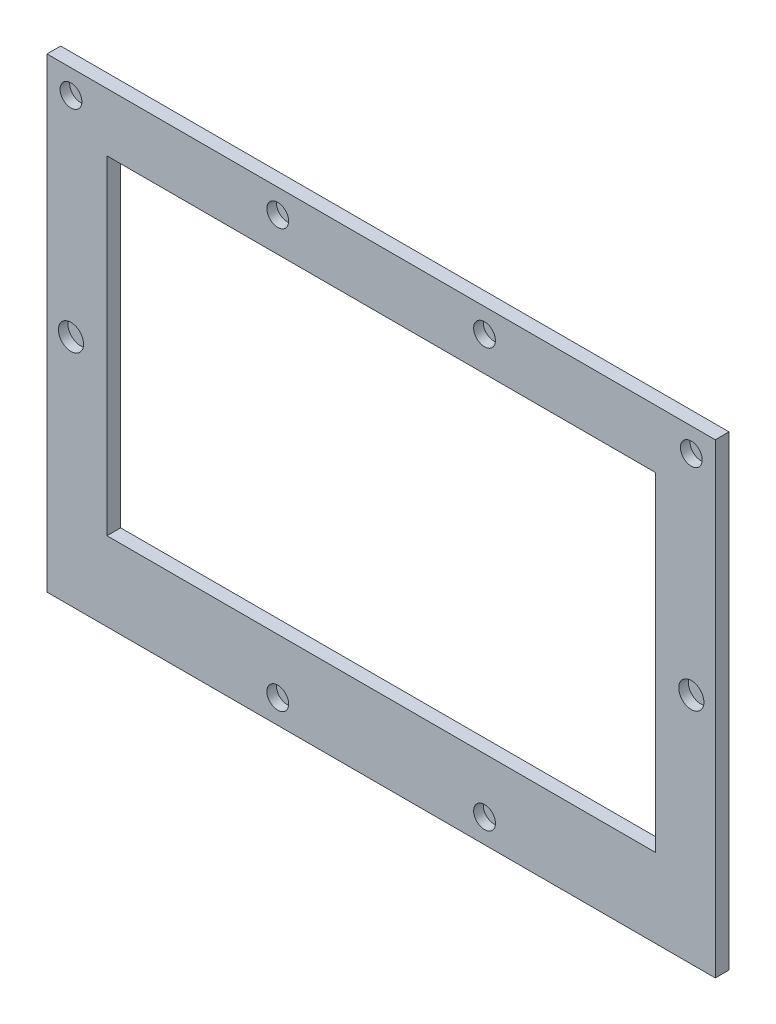
ISO-10303-21;
HEADER;
FILE_DESCRIPTION(('STEP AP214'),'2;1');
FILE_NAME('part.step','',(''),(''),'','','');
FILE_SCHEMA(('AUTOMOTIVE_DESIGN { 1 0 10303 214 1 1 1 1 }'));
ENDSEC;
DATA;
#1=APPLICATION_CONTEXT('core data for automotive mechanical design processes');
#2=APPLICATION_PROTOCOL_DEFINITION('international standard','automotive_design',2000,#1);
#3=PRODUCT_CONTEXT('',#1,'mechanical');
#4=PRODUCT('Part','Part','',(#3));
#5=PRODUCT_RELATED_PRODUCT_CATEGORY('part','',(#4));
#6=PRODUCT_DEFINITION_FORMATION('','',#4);
#7=PRODUCT_DEFINITION_CONTEXT('part definition',#1,'design');
#8=PRODUCT_DEFINITION('design','',#6,#7);
#9=PRODUCT_DEFINITION_SHAPE('','',#8);
#10=(LENGTH_UNIT() NAMED_UNIT(*) SI_UNIT(.MILLI.,.METRE.));
#11=(NAMED_UNIT(*) PLANE_ANGLE_UNIT() SI_UNIT($,.RADIAN.));
#12=(NAMED_UNIT(*) SI_UNIT($,.STERADIAN.) SOLID_ANGLE_UNIT());
#13=UNCERTAINTY_MEASURE_WITH_UNIT(LENGTH_MEASURE(1.E-05),#10,'distance_accuracy_value','');
#14=(GEOMETRIC_REPRESENTATION_CONTEXT(3) GLOBAL_UNCERTAINTY_ASSIGNED_CONTEXT((#13)) GLOBAL_UNIT_ASSIGNED_CONTEXT((#10,
#11,#12)) REPRESENTATION_CONTEXT('',''));
#15=CARTESIAN_POINT('',(0.,0.,0.));
#16=DIRECTION('',(0.,0.,1.));
#17=DIRECTION('',(1.,0.,0.));
#18=AXIS2_PLACEMENT_3D('',#15,#16,#17);
#19=CARTESIAN_POINT('',(0.,68.,-2.));
#20=DIRECTION('',(0.,1.,0.));
#21=DIRECTION('',(0.,0.,1.));
#22=AXIS2_PLACEMENT_3D('',#19,#20,#21);
#23=PLANE('',#22);
#24=DIRECTION('',(0.,0.,1.));
#25=VECTOR('',#24,1.);
#26=CARTESIAN_POINT('',(-97.5,68.,-2.));
#27=LINE('',#26,#25);
#28=CARTESIAN_POINT('',(-97.5,68.,-2.));
#29=VERTEX_POINT('',#28);
#30=CARTESIAN_POINT('',(-97.5,68.,2.));
#31=VERTEX_POINT('',#30);
#32=EDGE_CURVE('E109',#29,#31,#27,.T.);
#33=ORIENTED_EDGE('',*,*,#32,.T.);
#34=DIRECTION('',(-1.,0.,0.));
#35=VECTOR('',#34,1.);
#36=CARTESIAN_POINT('',(0.,68.,2.));
#37=LINE('',#36,#35);
#38=CARTESIAN_POINT('',(97.4999999999999,68.,2.));
#39=VERTEX_POINT('',#38);
#40=EDGE_CURVE('E112',#39,#31,#37,.T.);
#41=ORIENTED_EDGE('',*,*,#40,.F.);
#42=DIRECTION('',(0.,0.,1.));
#43=VECTOR('',#42,1.);
#44=CARTESIAN_POINT('',(97.4999999999999,68.,-2.));
#45=LINE('',#44,#43);
#46=CARTESIAN_POINT('',(97.4999999999999,68.,-2.));
#47=VERTEX_POINT('',#46);
#48=EDGE_CURVE('E11',#47,#39,#45,.T.);
#49=ORIENTED_EDGE('',*,*,#48,.F.);
#50=DIRECTION('',(-1.,0.,0.));
#51=VECTOR('',#50,1.);
#52=CARTESIAN_POINT('',(0.,68.,-2.));
#53=LINE('',#52,#51);
#54=EDGE_CURVE('E115',#47,#29,#53,.T.);
#55=ORIENTED_EDGE('',*,*,#54,.T.);
#56=EDGE_LOOP('',(#33,#41,#49,#55));
#57=FACE_BOUND('',#56,.T.);
#58=ADVANCED_FACE('F45',(#57),#23,.T.);
#59=CARTESIAN_POINT('',(97.4999999999999,0.,-2.));
#60=DIRECTION('',(-1.,0.,0.));
#61=DIRECTION('',(0.,0.,1.));
#62=AXIS2_PLACEMENT_3D('',#59,#60,#61);
#63=PLANE('',#62);
#64=ORIENTED_EDGE('',*,*,#48,.T.);
#65=DIRECTION('',(0.,-1.,0.));
#66=VECTOR('',#65,1.);
#67=CARTESIAN_POINT('',(97.4999999999999,0.,2.));
#68=LINE('',#67,#66);
#69=CARTESIAN_POINT('',(97.4999999999999,-68.,2.));
#70=VERTEX_POINT('',#69);
#71=EDGE_CURVE('E135',#39,#70,#68,.T.);
#72=ORIENTED_EDGE('',*,*,#71,.T.);
#73=DIRECTION('',(0.,0.,1.));
#74=VECTOR('',#73,1.);
#75=CARTESIAN_POINT('',(97.4999999999999,-68.,-2.));
#76=LINE('',#75,#74);
#77=CARTESIAN_POINT('',(97.4999999999999,-68.,-2.));
#78=VERTEX_POINT('',#77);
#79=EDGE_CURVE('E55',#78,#70,#76,.T.);
#80=ORIENTED_EDGE('',*,*,#79,.F.);
#81=DIRECTION('',(0.,-1.,0.));
#82=VECTOR('',#81,1.);
#83=CARTESIAN_POINT('',(97.4999999999999,0.,-2.));
#84=LINE('',#83,#82);
#85=EDGE_CURVE('E186',#47,#78,#84,.T.);
#86=ORIENTED_EDGE('',*,*,#85,.F.);
#87=EDGE_LOOP('',(#64,#72,#80,#86));
#88=FACE_BOUND('',#87,.T.);
#89=ADVANCED_FACE('F228',(#88),#63,.F.);
#90=CARTESIAN_POINT('',(0.,-68.,-2.));
#91=DIRECTION('',(0.,1.,0.));
#92=DIRECTION('',(0.,0.,1.));
#93=AXIS2_PLACEMENT_3D('',#90,#91,#92);
#94=PLANE('',#93);
#95=ORIENTED_EDGE('',*,*,#79,.T.);
#96=DIRECTION('',(-1.,0.,0.));
#97=VECTOR('',#96,1.);
#98=CARTESIAN_POINT('',(0.,-68.,2.));
#99=LINE('',#98,#97);
#100=CARTESIAN_POINT('',(-97.5,-68.,2.));
#101=VERTEX_POINT('',#100);
#102=EDGE_CURVE('E130',#70,#101,#99,.T.);
#103=ORIENTED_EDGE('',*,*,#102,.T.);
#104=DIRECTION('',(0.,0.,1.));
#105=VECTOR('',#104,1.);
#106=CARTESIAN_POINT('',(-97.5,-68.,-2.));
#107=LINE('',#106,#105);
#108=CARTESIAN_POINT('',(-97.5,-68.,-2.));
#109=VERTEX_POINT('',#108);
#110=EDGE_CURVE('E120',#109,#101,#107,.T.);
#111=ORIENTED_EDGE('',*,*,#110,.F.);
#112=DIRECTION('',(-1.,0.,0.));
#113=VECTOR('',#112,1.);
#114=CARTESIAN_POINT('',(0.,-68.,-2.));
#115=LINE('',#114,#113);
#116=EDGE_CURVE('E69',#78,#109,#115,.T.);
#117=ORIENTED_EDGE('',*,*,#116,.F.);
#118=EDGE_LOOP('',(#95,#103,#111,#117));
#119=FACE_BOUND('',#118,.T.);
#120=ADVANCED_FACE('F233',(#119),#94,.F.);
#121=CARTESIAN_POINT('',(0.,-45.,-2.));
#122=DIRECTION('',(0.,1.,0.));
#123=DIRECTION('',(-1.,0.,0.));
#124=AXIS2_PLACEMENT_3D('',#121,#122,#123);
#125=PLANE('',#124);
#126=DIRECTION('',(0.,0.,1.));
#127=VECTOR('',#126,1.);
#128=CARTESIAN_POINT('',(-80.,-45.,-2.));
#129=LINE('',#128,#127);
#130=CARTESIAN_POINT('',(-80.,-45.,-2.));
#131=VERTEX_POINT('',#130);
#132=CARTESIAN_POINT('',(-80.,-45.,2.));
#133=VERTEX_POINT('',#132);
#134=EDGE_CURVE('E49',#131,#133,#129,.T.);
#135=ORIENTED_EDGE('',*,*,#134,.T.);
#136=DIRECTION('',(-1.,0.,0.));
#137=VECTOR('',#136,1.);
#138=CARTESIAN_POINT('',(0.,-45.,2.));
#139=LINE('',#138,#137);
#140=CARTESIAN_POINT('',(80.,-45.,2.));
#141=VERTEX_POINT('',#140);
#142=EDGE_CURVE('E149',#141,#133,#139,.T.);
#143=ORIENTED_EDGE('',*,*,#142,.F.);
#144=DIRECTION('',(0.,0.,1.));
#145=VECTOR('',#144,1.);
#146=CARTESIAN_POINT('',(80.,-45.,-2.));
#147=LINE('',#146,#145);
#148=CARTESIAN_POINT('',(80.,-45.,-2.));
#149=VERTEX_POINT('',#148);
#150=EDGE_CURVE('E121',#149,#141,#147,.T.);
#151=ORIENTED_EDGE('',*,*,#150,.F.);
#152=DIRECTION('',(-1.,0.,0.));
#153=VECTOR('',#152,1.);
#154=CARTESIAN_POINT('',(0.,-45.,-2.));
#155=LINE('',#154,#153);
#156=EDGE_CURVE('E165',#149,#131,#155,.T.);
#157=ORIENTED_EDGE('',*,*,#156,.T.);
#158=EDGE_LOOP('',(#135,#143,#151,#157));
#159=FACE_BOUND('',#158,.T.);
#160=ADVANCED_FACE('F47',(#159),#125,.T.);
#161=CARTESIAN_POINT('',(80.,0.,-2.));
#162=DIRECTION('',(1.,0.,0.));
#163=DIRECTION('',(0.,0.,-1.));
#164=AXIS2_PLACEMENT_3D('',#161,#162,#163);
#165=PLANE('',#164);
#166=ORIENTED_EDGE('',*,*,#150,.T.);
#167=DIRECTION('',(0.,1.,0.));
#168=VECTOR('',#167,1.);
#169=CARTESIAN_POINT('',(80.,0.,2.));
#170=LINE('',#169,#168);
#171=CARTESIAN_POINT('',(80.,51.,2.));
#172=VERTEX_POINT('',#171);
#173=EDGE_CURVE('E161',#141,#172,#170,.T.);
#174=ORIENTED_EDGE('',*,*,#173,.T.);
#175=DIRECTION('',(0.,0.,1.));
#176=VECTOR('',#175,1.);
#177=CARTESIAN_POINT('',(80.,51.,-2.));
#178=LINE('',#177,#176);
#179=CARTESIAN_POINT('',(80.,51.,-2.));
#180=VERTEX_POINT('',#179);
#181=EDGE_CURVE('E195',#180,#172,#178,.T.);
#182=ORIENTED_EDGE('',*,*,#181,.F.);
#183=DIRECTION('',(0.,1.,0.));
#184=VECTOR('',#183,1.);
#185=CARTESIAN_POINT('',(80.,0.,-2.));
#186=LINE('',#185,#184);
#187=EDGE_CURVE('E176',#149,#180,#186,.T.);
#188=ORIENTED_EDGE('',*,*,#187,.F.);
#189=EDGE_LOOP('',(#166,#174,#182,#188));
#190=FACE_BOUND('',#189,.T.);
#191=ADVANCED_FACE('F212',(#190),#165,.F.);
#192=CARTESIAN_POINT('',(0.,51.,-2.));
#193=DIRECTION('',(0.,1.,0.));
#194=DIRECTION('',(-1.,0.,0.));
#195=AXIS2_PLACEMENT_3D('',#192,#193,#194);
#196=PLANE('',#195);
#197=ORIENTED_EDGE('',*,*,#181,.T.);
#198=DIRECTION('',(-1.,0.,0.));
#199=VECTOR('',#198,1.);
#200=CARTESIAN_POINT('',(0.,51.,2.));
#201=LINE('',#200,#199);
#202=CARTESIAN_POINT('',(-80.,51.,2.));
#203=VERTEX_POINT('',#202);
#204=EDGE_CURVE('E157',#172,#203,#201,.T.);
#205=ORIENTED_EDGE('',*,*,#204,.T.);
#206=DIRECTION('',(0.,0.,1.));
#207=VECTOR('',#206,1.);
#208=CARTESIAN_POINT('',(-80.,51.,-2.));
#209=LINE('',#208,#207);
#210=CARTESIAN_POINT('',(-80.,51.,-2.));
#211=VERTEX_POINT('',#210);
#212=EDGE_CURVE('E197',#211,#203,#209,.T.);
#213=ORIENTED_EDGE('',*,*,#212,.F.);
#214=DIRECTION('',(-1.,0.,0.));
#215=VECTOR('',#214,1.);
#216=CARTESIAN_POINT('',(0.,51.,-2.));
#217=LINE('',#216,#215);
#218=EDGE_CURVE('E173',#180,#211,#217,.T.);
#219=ORIENTED_EDGE('',*,*,#218,.F.);
#220=EDGE_LOOP('',(#197,#205,#213,#219));
#221=FACE_BOUND('',#220,.T.);
#222=ADVANCED_FACE('F219',(#221),#196,.F.);
#223=CARTESIAN_POINT('',(-80.,0.,-2.));
#224=DIRECTION('',(1.,0.,0.));
#225=DIRECTION('',(0.,0.,-1.));
#226=AXIS2_PLACEMENT_3D('',#223,#224,#225);
#227=PLANE('',#226);
#228=ORIENTED_EDGE('',*,*,#212,.T.);
#229=DIRECTION('',(0.,1.,0.));
#230=VECTOR('',#229,1.);
#231=CARTESIAN_POINT('',(-80.,0.,2.));
#232=LINE('',#231,#230);
#233=EDGE_CURVE('E153',#133,#203,#232,.T.);
#234=ORIENTED_EDGE('',*,*,#233,.F.);
#235=ORIENTED_EDGE('',*,*,#134,.F.);
#236=DIRECTION('',(0.,1.,0.));
#237=VECTOR('',#236,1.);
#238=CARTESIAN_POINT('',(-80.,0.,-2.));
#239=LINE('',#238,#237);
#240=EDGE_CURVE('E169',#131,#211,#239,.T.);
#241=ORIENTED_EDGE('',*,*,#240,.T.);
#242=EDGE_LOOP('',(#228,#234,#235,#241));
#243=FACE_BOUND('',#242,.T.);
#244=ADVANCED_FACE('F208',(#243),#227,.T.);
#245=CARTESIAN_POINT('',(-97.5,0.,-2.));
#246=DIRECTION('',(-1.,0.,0.));
#247=DIRECTION('',(0.,0.,1.));
#248=AXIS2_PLACEMENT_3D('',#245,#246,#247);
#249=PLANE('',#248);
#250=ORIENTED_EDGE('',*,*,#110,.T.);
#251=DIRECTION('',(0.,-1.,0.));
#252=VECTOR('',#251,1.);
#253=CARTESIAN_POINT('',(-97.5,0.,2.));
#254=LINE('',#253,#252);
#255=EDGE_CURVE('E124',#31,#101,#254,.T.);
#256=ORIENTED_EDGE('',*,*,#255,.F.);
#257=ORIENTED_EDGE('',*,*,#32,.F.);
#258=DIRECTION('',(0.,-1.,0.));
#259=VECTOR('',#258,1.);
#260=CARTESIAN_POINT('',(-97.5,0.,-2.));
#261=LINE('',#260,#259);
#262=EDGE_CURVE('E181',#29,#109,#261,.T.);
#263=ORIENTED_EDGE('',*,*,#262,.T.);
#264=EDGE_LOOP('',(#250,#256,#257,#263));
#265=FACE_BOUND('',#264,.T.);
#266=ADVANCED_FACE('F125',(#265),#249,.T.);
#267=CARTESIAN_POINT('',(0.,0.,-2.));
#268=DIRECTION('',(0.,0.,1.));
#269=DIRECTION('',(1.,0.,0.));
#270=AXIS2_PLACEMENT_3D('',#267,#268,#269);
#271=PLANE('',#270);
#272=ORIENTED_EDGE('',*,*,#156,.F.);
#273=ORIENTED_EDGE('',*,*,#187,.T.);
#274=ORIENTED_EDGE('',*,*,#218,.T.);
#275=ORIENTED_EDGE('',*,*,#240,.F.);
#276=EDGE_LOOP('',(#272,#273,#274,#275));
#277=FACE_BOUND('',#276,.T.);
#278=ORIENTED_EDGE('',*,*,#54,.F.);
#279=ORIENTED_EDGE('',*,*,#85,.T.);
#280=ORIENTED_EDGE('',*,*,#116,.T.);
#281=ORIENTED_EDGE('',*,*,#262,.F.);
#282=EDGE_LOOP('',(#278,#279,#280,#281));
#283=FACE_BOUND('',#282,.T.);
#284=ADVANCED_FACE('F216',(#277,#283),#271,.F.);
#285=CARTESIAN_POINT('',(0.,0.,2.));
#286=DIRECTION('',(0.,0.,1.));
#287=DIRECTION('',(1.,0.,0.));
#288=AXIS2_PLACEMENT_3D('',#285,#286,#287);
#289=PLANE('',#288);
#290=CARTESIAN_POINT('',(-90.5,0.,2.));
#291=DIRECTION('',(0.,0.,1.));
#292=DIRECTION('',(1.,0.,0.));
#293=AXIS2_PLACEMENT_3D('',#290,#291,#292);
#294=CIRCLE('',#293,3.67372256576082);
#295=CARTESIAN_POINT('',(-86.8262774342392,0.,2.));
#296=VERTEX_POINT('',#295);
#297=EDGE_CURVE('E341',#296,#296,#294,.T.);
#298=ORIENTED_EDGE('',*,*,#297,.F.);
#299=EDGE_LOOP('',(#298));
#300=FACE_BOUND('',#299,.T.);
#301=CARTESIAN_POINT('',(90.5,61.,2.));
#302=DIRECTION('',(0.,0.,1.));
#303=DIRECTION('',(1.,0.,0.));
#304=AXIS2_PLACEMENT_3D('',#301,#302,#303);
#305=CIRCLE('',#304,3.175);
#306=CARTESIAN_POINT('',(93.675,61.,2.));
#307=VERTEX_POINT('',#306);
#308=EDGE_CURVE('E349',#307,#307,#305,.T.);
#309=ORIENTED_EDGE('',*,*,#308,.F.);
#310=EDGE_LOOP('',(#309));
#311=FACE_BOUND('',#310,.T.);
#312=CARTESIAN_POINT('',(-30.1666666666667,-61.,2.));
#313=DIRECTION('',(0.,0.,1.));
#314=DIRECTION('',(1.,0.,0.));
#315=AXIS2_PLACEMENT_3D('',#312,#313,#314);
#316=CIRCLE('',#315,3.175);
#317=CARTESIAN_POINT('',(-26.9916666666667,-61.,2.));
#318=VERTEX_POINT('',#317);
#319=EDGE_CURVE('E357',#318,#318,#316,.T.);
#320=ORIENTED_EDGE('',*,*,#319,.F.);
#321=EDGE_LOOP('',(#320));
#322=FACE_BOUND('',#321,.T.);
#323=CARTESIAN_POINT('',(30.1666666666666,-61.,2.));
#324=DIRECTION('',(0.,0.,1.));
#325=DIRECTION('',(1.,0.,0.));
#326=AXIS2_PLACEMENT_3D('',#323,#324,#325);
#327=CIRCLE('',#326,3.175);
#328=CARTESIAN_POINT('',(33.3416666666666,-61.,2.));
#329=VERTEX_POINT('',#328);
#330=EDGE_CURVE('E365',#329,#329,#327,.T.);
#331=ORIENTED_EDGE('',*,*,#330,.F.);
#332=EDGE_LOOP('',(#331));
#333=FACE_BOUND('',#332,.T.);
#334=CARTESIAN_POINT('',(30.1666666666666,61.,2.));
#335=DIRECTION('',(0.,0.,1.));
#336=DIRECTION('',(1.,0.,0.));
#337=AXIS2_PLACEMENT_3D('',#334,#335,#336);
#338=CIRCLE('',#337,3.175);
#339=CARTESIAN_POINT('',(33.3416666666666,61.,2.));
#340=VERTEX_POINT('',#339);
#341=EDGE_CURVE('E317',#340,#340,#338,.T.);
#342=ORIENTED_EDGE('',*,*,#341,.F.);
#343=EDGE_LOOP('',(#342));
#344=FACE_BOUND('',#343,.T.);
#345=CARTESIAN_POINT('',(-30.1666666666667,61.,2.));
#346=DIRECTION('',(0.,0.,1.));
#347=DIRECTION('',(1.,0.,0.));
#348=AXIS2_PLACEMENT_3D('',#345,#346,#347);
#349=CIRCLE('',#348,3.175);
#350=CARTESIAN_POINT('',(-26.9916666666667,61.,2.));
#351=VERTEX_POINT('',#350);
#352=EDGE_CURVE('E325',#351,#351,#349,.T.);
#353=ORIENTED_EDGE('',*,*,#352,.F.);
#354=EDGE_LOOP('',(#353));
#355=FACE_BOUND('',#354,.T.);
#356=CARTESIAN_POINT('',(90.5,0.,2.));
#357=DIRECTION('',(0.,0.,1.));
#358=DIRECTION('',(1.,0.,0.));
#359=AXIS2_PLACEMENT_3D('',#356,#357,#358);
#360=CIRCLE('',#359,3.67372256576082);
#361=CARTESIAN_POINT('',(94.1737225657609,0.,2.));
#362=VERTEX_POINT('',#361);
#363=EDGE_CURVE('E329',#362,#362,#360,.T.);
#364=ORIENTED_EDGE('',*,*,#363,.F.);
#365=EDGE_LOOP('',(#364));
#366=FACE_BOUND('',#365,.T.);
#367=CARTESIAN_POINT('',(-90.5,61.,2.));
#368=DIRECTION('',(0.,0.,1.));
#369=DIRECTION('',(1.,0.,0.));
#370=AXIS2_PLACEMENT_3D('',#367,#368,#369);
#371=CIRCLE('',#370,3.175);
#372=CARTESIAN_POINT('',(-87.325,61.,2.));
#373=VERTEX_POINT('',#372);
#374=EDGE_CURVE('E141',#373,#373,#371,.T.);
#375=ORIENTED_EDGE('',*,*,#374,.F.);
#376=EDGE_LOOP('',(#375));
#377=FACE_BOUND('',#376,.T.);
#378=ORIENTED_EDGE('',*,*,#40,.T.);
#379=ORIENTED_EDGE('',*,*,#255,.T.);
#380=ORIENTED_EDGE('',*,*,#102,.F.);
#381=ORIENTED_EDGE('',*,*,#71,.F.);
#382=EDGE_LOOP('',(#378,#379,#380,#381));
#383=FACE_BOUND('',#382,.T.);
#384=ORIENTED_EDGE('',*,*,#142,.T.);
#385=ORIENTED_EDGE('',*,*,#233,.T.);
#386=ORIENTED_EDGE('',*,*,#204,.F.);
#387=ORIENTED_EDGE('',*,*,#173,.F.);
#388=EDGE_LOOP('',(#384,#385,#386,#387));
#389=FACE_BOUND('',#388,.T.);
#390=ADVANCED_FACE('F132',(#300,#311,#322,#333,#344,#355,#366,#377,#383,#389),#289,.T.);
#391=CARTESIAN_POINT('',(-90.5,61.,-0.794));
#392=DIRECTION('',(0.,0.,1.));
#393=DIRECTION('',(1.,0.,0.));
#394=AXIS2_PLACEMENT_3D('',#391,#392,#393);
#395=CYLINDRICAL_SURFACE('',#394,3.175);
#396=CARTESIAN_POINT('',(-90.5,61.,-0.794));
#397=DIRECTION('',(0.,0.,1.));
#398=DIRECTION('',(1.,0.,0.));
#399=AXIS2_PLACEMENT_3D('',#396,#397,#398);
#400=CIRCLE('',#399,3.175);
#401=CARTESIAN_POINT('',(-87.325,61.,-0.794));
#402=VERTEX_POINT('',#401);
#403=EDGE_CURVE('E137',#402,#402,#400,.T.);
#404=ORIENTED_EDGE('',*,*,#403,.F.);
#405=EDGE_LOOP('',(#404));
#406=FACE_BOUND('',#405,.T.);
#407=ORIENTED_EDGE('',*,*,#374,.T.);
#408=EDGE_LOOP('',(#407));
#409=FACE_BOUND('',#408,.T.);
#410=ADVANCED_FACE('F245',(#406,#409),#395,.F.);
#411=CARTESIAN_POINT('',(-90.5,61.,-0.794));
#412=DIRECTION('',(0.,0.,1.));
#413=DIRECTION('',(1.,0.,0.));
#414=AXIS2_PLACEMENT_3D('',#411,#412,#413);
#415=PLANE('',#414);
#416=ORIENTED_EDGE('',*,*,#403,.T.);
#417=EDGE_LOOP('',(#416));
#418=FACE_BOUND('',#417,.T.);
#419=ADVANCED_FACE('F249',(#418),#415,.T.);
#420=CARTESIAN_POINT('',(90.5,0.,-0.794));
#421=DIRECTION('',(0.,0.,1.));
#422=DIRECTION('',(1.,0.,0.));
#423=AXIS2_PLACEMENT_3D('',#420,#421,#422);
#424=CYLINDRICAL_SURFACE('',#423,3.67372256576082);
#425=CARTESIAN_POINT('',(90.5,0.,-0.794));
#426=DIRECTION('',(0.,0.,1.));
#427=DIRECTION('',(1.,0.,0.));
#428=AXIS2_PLACEMENT_3D('',#425,#426,#427);
#429=CIRCLE('',#428,3.67372256576082);
#430=CARTESIAN_POINT('',(94.1737225657609,0.,-0.794));
#431=VERTEX_POINT('',#430);
#432=EDGE_CURVE('E334',#431,#431,#429,.T.);
#433=ORIENTED_EDGE('',*,*,#432,.F.);
#434=EDGE_LOOP('',(#433));
#435=FACE_BOUND('',#434,.T.);
#436=ORIENTED_EDGE('',*,*,#363,.T.);
#437=EDGE_LOOP('',(#436));
#438=FACE_BOUND('',#437,.T.);
#439=ADVANCED_FACE('F253',(#435,#438),#424,.F.);
#440=CARTESIAN_POINT('',(90.5,0.,-0.794));
#441=DIRECTION('',(0.,0.,1.));
#442=DIRECTION('',(1.,0.,0.));
#443=AXIS2_PLACEMENT_3D('',#440,#441,#442);
#444=PLANE('',#443);
#445=ORIENTED_EDGE('',*,*,#432,.T.);
#446=EDGE_LOOP('',(#445));
#447=FACE_BOUND('',#446,.T.);
#448=ADVANCED_FACE('F296',(#447),#444,.T.);
#449=CARTESIAN_POINT('',(-30.1666666666667,61.,-0.794));
#450=DIRECTION('',(0.,0.,1.));
#451=DIRECTION('',(1.,0.,0.));
#452=AXIS2_PLACEMENT_3D('',#449,#450,#451);
#453=CYLINDRICAL_SURFACE('',#452,3.175);
#454=CARTESIAN_POINT('',(-30.1666666666667,61.,-0.794));
#455=DIRECTION('',(0.,0.,1.));
#456=DIRECTION('',(1.,0.,0.));
#457=AXIS2_PLACEMENT_3D('',#454,#455,#456);
#458=CIRCLE('',#457,3.175);
#459=CARTESIAN_POINT('',(-26.9916666666667,61.,-0.794));
#460=VERTEX_POINT('',#459);
#461=EDGE_CURVE('E320',#460,#460,#458,.T.);
#462=ORIENTED_EDGE('',*,*,#461,.F.);
#463=EDGE_LOOP('',(#462));
#464=FACE_BOUND('',#463,.T.);
#465=ORIENTED_EDGE('',*,*,#352,.T.);
#466=EDGE_LOOP('',(#465));
#467=FACE_BOUND('',#466,.T.);
#468=ADVANCED_FACE('F292',(#464,#467),#453,.F.);
#469=CARTESIAN_POINT('',(-30.1666666666667,61.,-0.794));
#470=DIRECTION('',(0.,0.,1.));
#471=DIRECTION('',(1.,0.,0.));
#472=AXIS2_PLACEMENT_3D('',#469,#470,#471);
#473=PLANE('',#472);
#474=ORIENTED_EDGE('',*,*,#461,.T.);
#475=EDGE_LOOP('',(#474));
#476=FACE_BOUND('',#475,.T.);
#477=ADVANCED_FACE('F288',(#476),#473,.T.);
#478=CARTESIAN_POINT('',(30.1666666666666,61.,-0.794));
#479=DIRECTION('',(0.,0.,1.));
#480=DIRECTION('',(1.,0.,0.));
#481=AXIS2_PLACEMENT_3D('',#478,#479,#480);
#482=CYLINDRICAL_SURFACE('',#481,3.175);
#483=CARTESIAN_POINT('',(30.1666666666666,61.,-0.794));
#484=DIRECTION('',(0.,0.,1.));
#485=DIRECTION('',(1.,0.,0.));
#486=AXIS2_PLACEMENT_3D('',#483,#484,#485);
#487=CIRCLE('',#486,3.175);
#488=CARTESIAN_POINT('',(33.3416666666666,61.,-0.794));
#489=VERTEX_POINT('',#488);
#490=EDGE_CURVE('E314',#489,#489,#487,.T.);
#491=ORIENTED_EDGE('',*,*,#490,.F.);
#492=EDGE_LOOP('',(#491));
#493=FACE_BOUND('',#492,.T.);
#494=ORIENTED_EDGE('',*,*,#341,.T.);
#495=EDGE_LOOP('',(#494));
#496=FACE_BOUND('',#495,.T.);
#497=ADVANCED_FACE('F291',(#493,#496),#482,.F.);
#498=CARTESIAN_POINT('',(30.1666666666666,61.,-0.794));
#499=DIRECTION('',(0.,0.,1.));
#500=DIRECTION('',(1.,0.,0.));
#501=AXIS2_PLACEMENT_3D('',#498,#499,#500);
#502=PLANE('',#501);
#503=ORIENTED_EDGE('',*,*,#490,.T.);
#504=EDGE_LOOP('',(#503));
#505=FACE_BOUND('',#504,.T.);
#506=ADVANCED_FACE('F263',(#505),#502,.T.);
#507=CARTESIAN_POINT('',(30.1666666666666,-61.,-0.794));
#508=DIRECTION('',(0.,0.,1.));
#509=DIRECTION('',(1.,0.,0.));
#510=AXIS2_PLACEMENT_3D('',#507,#508,#509);
#511=CYLINDRICAL_SURFACE('',#510,3.175);
#512=CARTESIAN_POINT('',(30.1666666666666,-61.,-0.794));
#513=DIRECTION('',(0.,0.,1.));
#514=DIRECTION('',(1.,0.,0.));
#515=AXIS2_PLACEMENT_3D('',#512,#513,#514);
#516=CIRCLE('',#515,3.175);
#517=CARTESIAN_POINT('',(33.3416666666666,-61.,-0.794));
#518=VERTEX_POINT('',#517);
#519=EDGE_CURVE('E333',#518,#518,#516,.T.);
#520=ORIENTED_EDGE('',*,*,#519,.F.);
#521=EDGE_LOOP('',(#520));
#522=FACE_BOUND('',#521,.T.);
#523=ORIENTED_EDGE('',*,*,#330,.T.);
#524=EDGE_LOOP('',(#523));
#525=FACE_BOUND('',#524,.T.);
#526=ADVANCED_FACE('F259',(#522,#525),#511,.F.);
#527=CARTESIAN_POINT('',(30.1666666666666,-61.,-0.794));
#528=DIRECTION('',(0.,0.,1.));
#529=DIRECTION('',(1.,0.,0.));
#530=AXIS2_PLACEMENT_3D('',#527,#528,#529);
#531=PLANE('',#530);
#532=ORIENTED_EDGE('',*,*,#519,.T.);
#533=EDGE_LOOP('',(#532));
#534=FACE_BOUND('',#533,.T.);
#535=ADVANCED_FACE('F255',(#534),#531,.T.);
#536=CARTESIAN_POINT('',(-30.1666666666667,-61.,-0.794));
#537=DIRECTION('',(0.,0.,1.));
#538=DIRECTION('',(1.,0.,0.));
#539=AXIS2_PLACEMENT_3D('',#536,#537,#538);
#540=CYLINDRICAL_SURFACE('',#539,3.175);
#541=CARTESIAN_POINT('',(-30.1666666666667,-61.,-0.794));
#542=DIRECTION('',(0.,0.,1.));
#543=DIRECTION('',(1.,0.,0.));
#544=AXIS2_PLACEMENT_3D('',#541,#542,#543);
#545=CIRCLE('',#544,3.175);
#546=CARTESIAN_POINT('',(-26.9916666666667,-61.,-0.794));
#547=VERTEX_POINT('',#546);
#548=EDGE_CURVE('E361',#547,#547,#545,.T.);
#549=ORIENTED_EDGE('',*,*,#548,.F.);
#550=EDGE_LOOP('',(#549));
#551=FACE_BOUND('',#550,.T.);
#552=ORIENTED_EDGE('',*,*,#319,.T.);
#553=EDGE_LOOP('',(#552));
#554=FACE_BOUND('',#553,.T.);
#555=ADVANCED_FACE('F258',(#551,#554),#540,.F.);
#556=CARTESIAN_POINT('',(-30.1666666666667,-61.,-0.794));
#557=DIRECTION('',(0.,0.,1.));
#558=DIRECTION('',(1.,0.,0.));
#559=AXIS2_PLACEMENT_3D('',#556,#557,#558);
#560=PLANE('',#559);
#561=ORIENTED_EDGE('',*,*,#548,.T.);
#562=EDGE_LOOP('',(#561));
#563=FACE_BOUND('',#562,.T.);
#564=ADVANCED_FACE('F265',(#563),#560,.T.);
#565=CARTESIAN_POINT('',(90.5,61.,-0.794));
#566=DIRECTION('',(0.,0.,1.));
#567=DIRECTION('',(1.,0.,0.));
#568=AXIS2_PLACEMENT_3D('',#565,#566,#567);
#569=CYLINDRICAL_SURFACE('',#568,3.175);
#570=CARTESIAN_POINT('',(90.5,61.,-0.794));
#571=DIRECTION('',(0.,0.,1.));
#572=DIRECTION('',(1.,0.,0.));
#573=AXIS2_PLACEMENT_3D('',#570,#571,#572);
#574=CIRCLE('',#573,3.175);
#575=CARTESIAN_POINT('',(93.675,61.,-0.794));
#576=VERTEX_POINT('',#575);
#577=EDGE_CURVE('E353',#576,#576,#574,.T.);
#578=ORIENTED_EDGE('',*,*,#577,.F.);
#579=EDGE_LOOP('',(#578));
#580=FACE_BOUND('',#579,.T.);
#581=ORIENTED_EDGE('',*,*,#308,.T.);
#582=EDGE_LOOP('',(#581));
#583=FACE_BOUND('',#582,.T.);
#584=ADVANCED_FACE('F268',(#580,#583),#569,.F.);
#585=CARTESIAN_POINT('',(90.5,61.,-0.794));
#586=DIRECTION('',(0.,0.,1.));
#587=DIRECTION('',(1.,0.,0.));
#588=AXIS2_PLACEMENT_3D('',#585,#586,#587);
#589=PLANE('',#588);
#590=ORIENTED_EDGE('',*,*,#577,.T.);
#591=EDGE_LOOP('',(#590));
#592=FACE_BOUND('',#591,.T.);
#593=ADVANCED_FACE('F273',(#592),#589,.T.);
#594=CARTESIAN_POINT('',(-90.5,0.,-0.794));
#595=DIRECTION('',(0.,0.,1.));
#596=DIRECTION('',(1.,0.,0.));
#597=AXIS2_PLACEMENT_3D('',#594,#595,#596);
#598=CYLINDRICAL_SURFACE('',#597,3.67372256576082);
#599=CARTESIAN_POINT('',(-90.5,0.,-0.794));
#600=DIRECTION('',(0.,0.,1.));
#601=DIRECTION('',(1.,0.,0.));
#602=AXIS2_PLACEMENT_3D('',#599,#600,#601);
#603=CIRCLE('',#602,3.67372256576082);
#604=CARTESIAN_POINT('',(-86.8262774342392,0.,-0.794));
#605=VERTEX_POINT('',#604);
#606=EDGE_CURVE('E345',#605,#605,#603,.T.);
#607=ORIENTED_EDGE('',*,*,#606,.F.);
#608=EDGE_LOOP('',(#607));
#609=FACE_BOUND('',#608,.T.);
#610=ORIENTED_EDGE('',*,*,#297,.T.);
#611=EDGE_LOOP('',(#610));
#612=FACE_BOUND('',#611,.T.);
#613=ADVANCED_FACE('F276',(#609,#612),#598,.F.);
#614=CARTESIAN_POINT('',(-90.5,0.,-0.794));
#615=DIRECTION('',(0.,0.,1.));
#616=DIRECTION('',(1.,0.,0.));
#617=AXIS2_PLACEMENT_3D('',#614,#615,#616);
#618=PLANE('',#617);
#619=ORIENTED_EDGE('',*,*,#606,.T.);
#620=EDGE_LOOP('',(#619));
#621=FACE_BOUND('',#620,.T.);
#622=ADVANCED_FACE('F281',(#621),#618,.T.);
#623=CLOSED_SHELL('',(#58,#89,#120,#160,#191,#222,#244,#266,#284,#390,#410,#419,#439,#448,#468,
#477,#497,#506,#526,#535,#555,#564,#584,#593,#613,#622));
#624=MANIFOLD_SOLID_BREP('B2',#623);
#625=ADVANCED_BREP_SHAPE_REPRESENTATION('',(#18,#624),#14);
#626=SHAPE_DEFINITION_REPRESENTATION(#9,#625);
ENDSEC;
END-ISO-10303-21;
